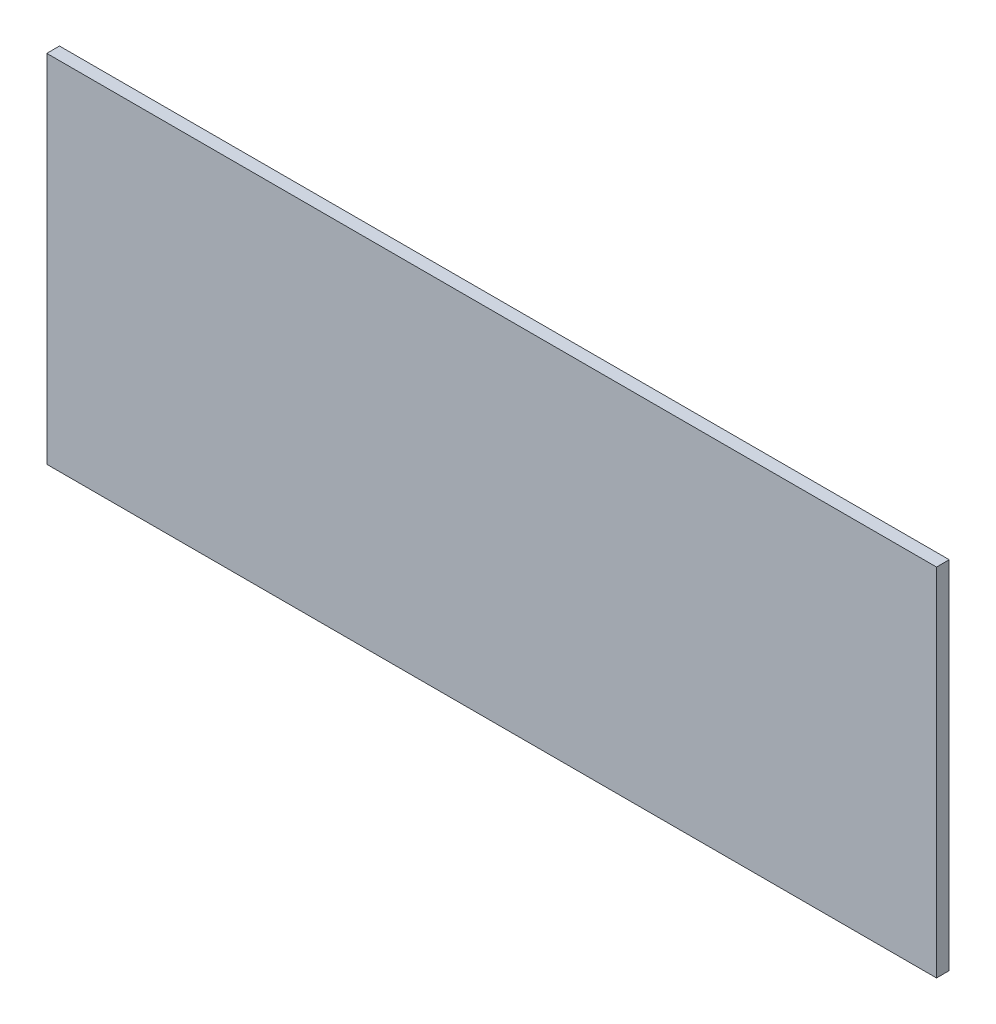
ISO-10303-21;
HEADER;
FILE_DESCRIPTION(('STEP AP214'),'2;1');
FILE_NAME('part.step','',(''),(''),'','','');
FILE_SCHEMA(('AUTOMOTIVE_DESIGN { 1 0 10303 214 1 1 1 1 }'));
ENDSEC;
DATA;
#1=APPLICATION_CONTEXT('core data for automotive mechanical design processes');
#2=APPLICATION_PROTOCOL_DEFINITION('international standard','automotive_design',2000,#1);
#3=PRODUCT_CONTEXT('',#1,'mechanical');
#4=PRODUCT('Part','Part','',(#3));
#5=PRODUCT_RELATED_PRODUCT_CATEGORY('part','',(#4));
#6=PRODUCT_DEFINITION_FORMATION('','',#4);
#7=PRODUCT_DEFINITION_CONTEXT('part definition',#1,'design');
#8=PRODUCT_DEFINITION('design','',#6,#7);
#9=PRODUCT_DEFINITION_SHAPE('','',#8);
#10=(LENGTH_UNIT() NAMED_UNIT(*) SI_UNIT(.MILLI.,.METRE.));
#11=(NAMED_UNIT(*) PLANE_ANGLE_UNIT() SI_UNIT($,.RADIAN.));
#12=(NAMED_UNIT(*) SI_UNIT($,.STERADIAN.) SOLID_ANGLE_UNIT());
#13=UNCERTAINTY_MEASURE_WITH_UNIT(LENGTH_MEASURE(1.E-05),#10,'distance_accuracy_value','');
#14=(GEOMETRIC_REPRESENTATION_CONTEXT(3) GLOBAL_UNCERTAINTY_ASSIGNED_CONTEXT((#13)) GLOBAL_UNIT_ASSIGNED_CONTEXT((#10,
#11,#12)) REPRESENTATION_CONTEXT('',''));
#15=CARTESIAN_POINT('',(0.,0.,0.));
#16=DIRECTION('',(0.,0.,1.));
#17=DIRECTION('',(1.,0.,0.));
#18=AXIS2_PLACEMENT_3D('',#15,#16,#17);
#19=CARTESIAN_POINT('',(-90.5016149039087,84.,-3.));
#20=DIRECTION('',(-1.,0.,0.));
#21=DIRECTION('',(0.,-1.,0.));
#22=AXIS2_PLACEMENT_3D('',#19,#20,#21);
#23=PLANE('',#22);
#24=DIRECTION('',(0.,-1.,0.));
#25=VECTOR('',#24,1.);
#26=CARTESIAN_POINT('',(-90.5016149039087,84.,0.));
#27=LINE('',#26,#25);
#28=CARTESIAN_POINT('',(-90.5016149039087,84.,0.));
#29=VERTEX_POINT('',#28);
#30=CARTESIAN_POINT('',(-90.5016149039087,0.,0.));
#31=VERTEX_POINT('',#30);
#32=EDGE_CURVE('E97',#29,#31,#27,.T.);
#33=ORIENTED_EDGE('',*,*,#32,.F.);
#34=DIRECTION('',(0.,0.,1.));
#35=VECTOR('',#34,1.);
#36=CARTESIAN_POINT('',(-90.5016149039087,84.,-3.));
#37=LINE('',#36,#35);
#38=CARTESIAN_POINT('',(-90.5016149039087,84.,-3.));
#39=VERTEX_POINT('',#38);
#40=EDGE_CURVE('E11',#39,#29,#37,.T.);
#41=ORIENTED_EDGE('',*,*,#40,.F.);
#42=DIRECTION('',(0.,-1.,0.));
#43=VECTOR('',#42,1.);
#44=CARTESIAN_POINT('',(-90.5016149039087,84.,-3.));
#45=LINE('',#44,#43);
#46=CARTESIAN_POINT('',(-90.5016149039087,0.,-3.));
#47=VERTEX_POINT('',#46);
#48=EDGE_CURVE('E91',#39,#47,#45,.T.);
#49=ORIENTED_EDGE('',*,*,#48,.T.);
#50=DIRECTION('',(0.,0.,1.));
#51=VECTOR('',#50,1.);
#52=CARTESIAN_POINT('',(-90.5016149039087,0.,-3.));
#53=LINE('',#52,#51);
#54=EDGE_CURVE('E36',#47,#31,#53,.T.);
#55=ORIENTED_EDGE('',*,*,#54,.T.);
#56=EDGE_LOOP('',(#33,#41,#49,#55));
#57=FACE_BOUND('',#56,.T.);
#58=ADVANCED_FACE('F33',(#57),#23,.T.);
#59=CARTESIAN_POINT('',(-90.5016149039087,84.,-3.));
#60=DIRECTION('',(0.,1.,0.));
#61=DIRECTION('',(0.,0.,1.));
#62=AXIS2_PLACEMENT_3D('',#59,#60,#61);
#63=PLANE('',#62);
#64=DIRECTION('',(-1.,0.,0.));
#65=VECTOR('',#64,1.);
#66=CARTESIAN_POINT('',(-90.5016149039087,84.,0.));
#67=LINE('',#66,#65);
#68=CARTESIAN_POINT('',(119.498385096091,84.,0.));
#69=VERTEX_POINT('',#68);
#70=EDGE_CURVE('E93',#69,#29,#67,.T.);
#71=ORIENTED_EDGE('',*,*,#70,.F.);
#72=DIRECTION('',(0.,0.,1.));
#73=VECTOR('',#72,1.);
#74=CARTESIAN_POINT('',(119.498385096091,84.,-3.));
#75=LINE('',#74,#73);
#76=CARTESIAN_POINT('',(119.498385096091,84.,-3.));
#77=VERTEX_POINT('',#76);
#78=EDGE_CURVE('E42',#77,#69,#75,.T.);
#79=ORIENTED_EDGE('',*,*,#78,.F.);
#80=DIRECTION('',(-1.,0.,0.));
#81=VECTOR('',#80,1.);
#82=CARTESIAN_POINT('',(-90.5016149039087,84.,-3.));
#83=LINE('',#82,#81);
#84=EDGE_CURVE('E88',#77,#39,#83,.T.);
#85=ORIENTED_EDGE('',*,*,#84,.T.);
#86=ORIENTED_EDGE('',*,*,#40,.T.);
#87=EDGE_LOOP('',(#71,#79,#85,#86));
#88=FACE_BOUND('',#87,.T.);
#89=ADVANCED_FACE('F107',(#88),#63,.T.);
#90=CARTESIAN_POINT('',(119.498385096091,84.,-3.));
#91=DIRECTION('',(1.,0.,0.));
#92=DIRECTION('',(0.,1.,0.));
#93=AXIS2_PLACEMENT_3D('',#90,#91,#92);
#94=PLANE('',#93);
#95=DIRECTION('',(0.,1.,0.));
#96=VECTOR('',#95,1.);
#97=CARTESIAN_POINT('',(119.498385096091,84.,0.));
#98=LINE('',#97,#96);
#99=CARTESIAN_POINT('',(119.498385096091,0.,0.));
#100=VERTEX_POINT('',#99);
#101=EDGE_CURVE('E83',#100,#69,#98,.T.);
#102=ORIENTED_EDGE('',*,*,#101,.F.);
#103=DIRECTION('',(0.,0.,1.));
#104=VECTOR('',#103,1.);
#105=CARTESIAN_POINT('',(119.498385096091,0.,-3.));
#106=LINE('',#105,#104);
#107=CARTESIAN_POINT('',(119.498385096091,0.,-3.));
#108=VERTEX_POINT('',#107);
#109=EDGE_CURVE('E78',#108,#100,#106,.T.);
#110=ORIENTED_EDGE('',*,*,#109,.F.);
#111=DIRECTION('',(0.,1.,0.));
#112=VECTOR('',#111,1.);
#113=CARTESIAN_POINT('',(119.498385096091,84.,-3.));
#114=LINE('',#113,#112);
#115=EDGE_CURVE('E81',#108,#77,#114,.T.);
#116=ORIENTED_EDGE('',*,*,#115,.T.);
#117=ORIENTED_EDGE('',*,*,#78,.T.);
#118=EDGE_LOOP('',(#102,#110,#116,#117));
#119=FACE_BOUND('',#118,.T.);
#120=ADVANCED_FACE('F80',(#119),#94,.T.);
#121=CARTESIAN_POINT('',(-90.5016149039087,0.,-3.));
#122=DIRECTION('',(0.,-1.,0.));
#123=DIRECTION('',(0.,0.,-1.));
#124=AXIS2_PLACEMENT_3D('',#121,#122,#123);
#125=PLANE('',#124);
#126=DIRECTION('',(1.,0.,0.));
#127=VECTOR('',#126,1.);
#128=CARTESIAN_POINT('',(-90.5016149039087,0.,0.));
#129=LINE('',#128,#127);
#130=EDGE_CURVE('E100',#31,#100,#129,.T.);
#131=ORIENTED_EDGE('',*,*,#130,.F.);
#132=ORIENTED_EDGE('',*,*,#54,.F.);
#133=DIRECTION('',(1.,0.,0.));
#134=VECTOR('',#133,1.);
#135=CARTESIAN_POINT('',(-90.5016149039087,0.,-3.));
#136=LINE('',#135,#134);
#137=EDGE_CURVE('E87',#47,#108,#136,.T.);
#138=ORIENTED_EDGE('',*,*,#137,.T.);
#139=ORIENTED_EDGE('',*,*,#109,.T.);
#140=EDGE_LOOP('',(#131,#132,#138,#139));
#141=FACE_BOUND('',#140,.T.);
#142=ADVANCED_FACE('F90',(#141),#125,.T.);
#143=CARTESIAN_POINT('',(0.,0.,-3.));
#144=DIRECTION('',(0.,0.,1.));
#145=DIRECTION('',(1.,0.,0.));
#146=AXIS2_PLACEMENT_3D('',#143,#144,#145);
#147=PLANE('',#146);
#148=ORIENTED_EDGE('',*,*,#48,.F.);
#149=ORIENTED_EDGE('',*,*,#84,.F.);
#150=ORIENTED_EDGE('',*,*,#115,.F.);
#151=ORIENTED_EDGE('',*,*,#137,.F.);
#152=EDGE_LOOP('',(#148,#149,#150,#151));
#153=FACE_BOUND('',#152,.T.);
#154=ADVANCED_FACE('F86',(#153),#147,.F.);
#155=CARTESIAN_POINT('',(0.,0.,0.));
#156=DIRECTION('',(0.,0.,1.));
#157=DIRECTION('',(1.,0.,0.));
#158=AXIS2_PLACEMENT_3D('',#155,#156,#157);
#159=PLANE('',#158);
#160=ORIENTED_EDGE('',*,*,#32,.T.);
#161=ORIENTED_EDGE('',*,*,#130,.T.);
#162=ORIENTED_EDGE('',*,*,#101,.T.);
#163=ORIENTED_EDGE('',*,*,#70,.T.);
#164=EDGE_LOOP('',(#160,#161,#162,#163));
#165=FACE_BOUND('',#164,.T.);
#166=ADVANCED_FACE('F106',(#165),#159,.T.);
#167=CLOSED_SHELL('',(#58,#89,#120,#142,#154,#166));
#168=MANIFOLD_SOLID_BREP('B2',#167);
#169=ADVANCED_BREP_SHAPE_REPRESENTATION('',(#18,#168),#14);
#170=SHAPE_DEFINITION_REPRESENTATION(#9,#169);
ENDSEC;
END-ISO-10303-21;
